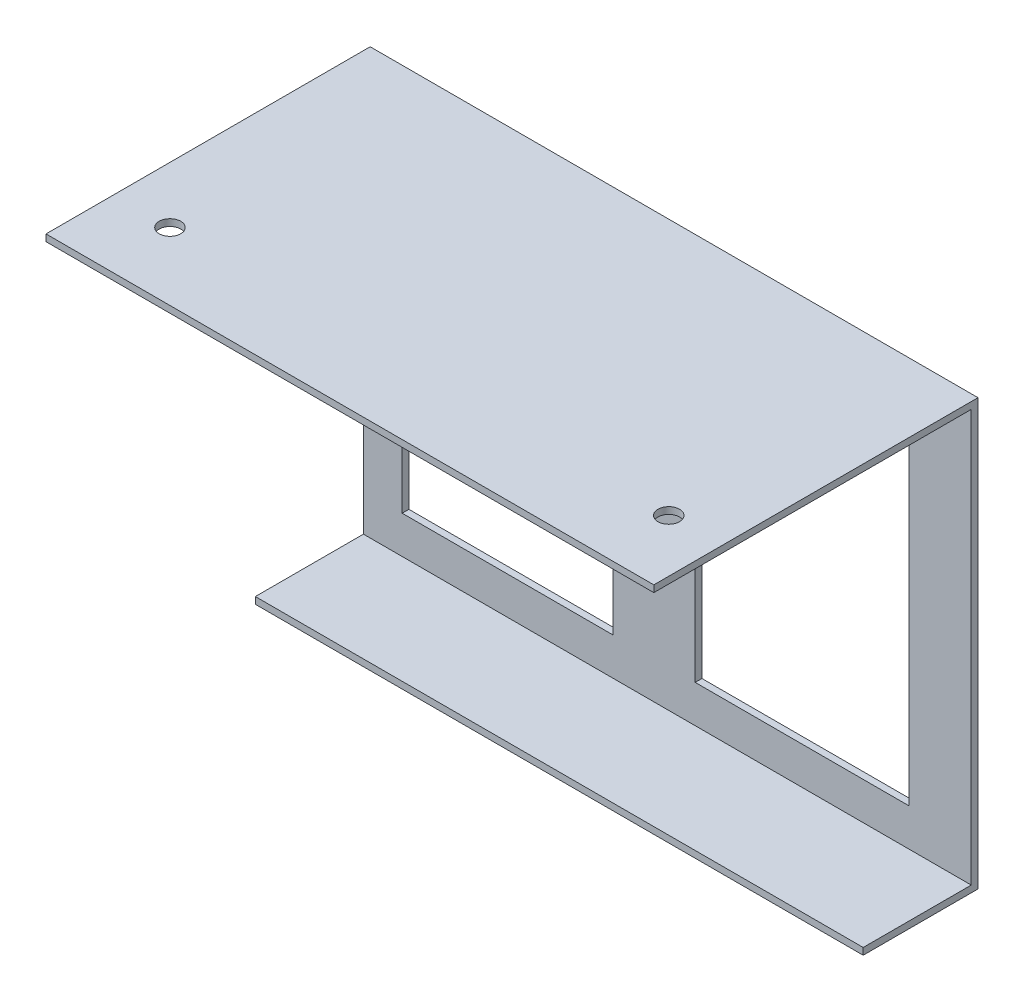
ISO-10303-21;
HEADER;
FILE_DESCRIPTION(('STEP AP214'),'2;1');
FILE_NAME('part.step','',(''),(''),'','','');
FILE_SCHEMA(('AUTOMOTIVE_DESIGN { 1 0 10303 214 1 1 1 1 }'));
ENDSEC;
DATA;
#1=APPLICATION_CONTEXT('core data for automotive mechanical design processes');
#2=APPLICATION_PROTOCOL_DEFINITION('international standard','automotive_design',2000,#1);
#3=PRODUCT_CONTEXT('',#1,'mechanical');
#4=PRODUCT('Part','Part','',(#3));
#5=PRODUCT_RELATED_PRODUCT_CATEGORY('part','',(#4));
#6=PRODUCT_DEFINITION_FORMATION('','',#4);
#7=PRODUCT_DEFINITION_CONTEXT('part definition',#1,'design');
#8=PRODUCT_DEFINITION('design','',#6,#7);
#9=PRODUCT_DEFINITION_SHAPE('','',#8);
#10=(LENGTH_UNIT() NAMED_UNIT(*) SI_UNIT(.MILLI.,.METRE.));
#11=(NAMED_UNIT(*) PLANE_ANGLE_UNIT() SI_UNIT($,.RADIAN.));
#12=(NAMED_UNIT(*) SI_UNIT($,.STERADIAN.) SOLID_ANGLE_UNIT());
#13=UNCERTAINTY_MEASURE_WITH_UNIT(LENGTH_MEASURE(1.E-05),#10,'distance_accuracy_value','');
#14=(GEOMETRIC_REPRESENTATION_CONTEXT(3) GLOBAL_UNCERTAINTY_ASSIGNED_CONTEXT((#13)) GLOBAL_UNIT_ASSIGNED_CONTEXT((#10,
#11,#12)) REPRESENTATION_CONTEXT('',''));
#15=CARTESIAN_POINT('',(0.,0.,0.));
#16=DIRECTION('',(0.,0.,1.));
#17=DIRECTION('',(1.,0.,0.));
#18=AXIS2_PLACEMENT_3D('',#15,#16,#17);
#19=CARTESIAN_POINT('',(0.,0.,1.));
#20=DIRECTION('',(0.,0.,-1.));
#21=DIRECTION('',(-1.,0.,0.));
#22=AXIS2_PLACEMENT_3D('',#19,#20,#21);
#23=PLANE('',#22);
#24=DIRECTION('',(1.,0.,0.));
#25=VECTOR('',#24,1.);
#26=CARTESIAN_POINT('',(49.1244560459894,6.55207074621018,1.));
#27=LINE('',#26,#25);
#28=CARTESIAN_POINT('',(49.1244560459894,6.55207074621018,1.));
#29=VERTEX_POINT('',#28);
#30=CARTESIAN_POINT('',(80.7788178948838,6.55207074621018,1.));
#31=VERTEX_POINT('',#30);
#32=EDGE_CURVE('E159',#29,#31,#27,.T.);
#33=ORIENTED_EDGE('',*,*,#32,.F.);
#34=DIRECTION('',(0.,-1.,0.));
#35=VECTOR('',#34,1.);
#36=CARTESIAN_POINT('',(49.1244560459894,55.4419643645238,1.));
#37=LINE('',#36,#35);
#38=CARTESIAN_POINT('',(49.1244560459894,55.4419643645238,1.));
#39=VERTEX_POINT('',#38);
#40=EDGE_CURVE('E50',#39,#29,#37,.T.);
#41=ORIENTED_EDGE('',*,*,#40,.F.);
#42=DIRECTION('',(-1.,0.,0.));
#43=VECTOR('',#42,1.);
#44=CARTESIAN_POINT('',(49.1244560459894,55.4419643645238,1.));
#45=LINE('',#44,#43);
#46=CARTESIAN_POINT('',(80.7788178948838,55.4419643645238,1.));
#47=VERTEX_POINT('',#46);
#48=EDGE_CURVE('E165',#47,#39,#45,.T.);
#49=ORIENTED_EDGE('',*,*,#48,.F.);
#50=DIRECTION('',(0.,1.,0.));
#51=VECTOR('',#50,1.);
#52=CARTESIAN_POINT('',(80.7788178948838,55.4419643645238,1.));
#53=LINE('',#52,#51);
#54=EDGE_CURVE('E150',#31,#47,#53,.T.);
#55=ORIENTED_EDGE('',*,*,#54,.F.);
#56=EDGE_LOOP('',(#33,#41,#49,#55));
#57=FACE_BOUND('',#56,.T.);
#58=DIRECTION('',(1.,0.,0.));
#59=VECTOR('',#58,1.);
#60=CARTESIAN_POINT('',(5.7338371556617,6.55207074621018,1.));
#61=LINE('',#60,#59);
#62=CARTESIAN_POINT('',(5.7338371556617,6.55207074621018,1.));
#63=VERTEX_POINT('',#62);
#64=CARTESIAN_POINT('',(36.9858130488498,6.55207074621018,1.));
#65=VERTEX_POINT('',#64);
#66=EDGE_CURVE('E176',#63,#65,#61,.T.);
#67=ORIENTED_EDGE('',*,*,#66,.F.);
#68=DIRECTION('',(0.,-1.,0.));
#69=VECTOR('',#68,1.);
#70=CARTESIAN_POINT('',(5.7338371556617,55.4419643645238,1.));
#71=LINE('',#70,#69);
#72=CARTESIAN_POINT('',(5.7338371556617,55.4419643645238,1.));
#73=VERTEX_POINT('',#72);
#74=EDGE_CURVE('E172',#73,#63,#71,.T.);
#75=ORIENTED_EDGE('',*,*,#74,.F.);
#76=DIRECTION('',(-1.,0.,0.));
#77=VECTOR('',#76,1.);
#78=CARTESIAN_POINT('',(5.7338371556617,55.4419643645238,1.));
#79=LINE('',#78,#77);
#80=CARTESIAN_POINT('',(36.9858130488498,55.4419643645238,1.));
#81=VERTEX_POINT('',#80);
#82=EDGE_CURVE('E182',#81,#73,#79,.T.);
#83=ORIENTED_EDGE('',*,*,#82,.F.);
#84=DIRECTION('',(0.,1.,0.));
#85=VECTOR('',#84,1.);
#86=CARTESIAN_POINT('',(36.9858130488498,55.4419643645238,1.));
#87=LINE('',#86,#85);
#88=EDGE_CURVE('E179',#65,#81,#87,.T.);
#89=ORIENTED_EDGE('',*,*,#88,.F.);
#90=EDGE_LOOP('',(#67,#75,#83,#89));
#91=FACE_BOUND('',#90,.T.);
#92=DIRECTION('',(1.,0.,0.));
#93=VECTOR('',#92,1.);
#94=CARTESIAN_POINT('',(0.,62.,1.));
#95=LINE('',#94,#93);
#96=CARTESIAN_POINT('',(0.,62.,1.));
#97=VERTEX_POINT('',#96);
#98=CARTESIAN_POINT('',(90.,62.,1.));
#99=VERTEX_POINT('',#98);
#100=EDGE_CURVE('E203',#97,#99,#95,.T.);
#101=ORIENTED_EDGE('',*,*,#100,.F.);
#102=DIRECTION('',(0.,-1.,0.));
#103=VECTOR('',#102,1.);
#104=CARTESIAN_POINT('',(0.,0.,1.));
#105=LINE('',#104,#103);
#106=CARTESIAN_POINT('',(0.,1.,1.));
#107=VERTEX_POINT('',#106);
#108=EDGE_CURVE('E242',#97,#107,#105,.T.);
#109=ORIENTED_EDGE('',*,*,#108,.T.);
#110=DIRECTION('',(-1.,0.,0.));
#111=VECTOR('',#110,1.);
#112=CARTESIAN_POINT('',(0.,1.,1.));
#113=LINE('',#112,#111);
#114=CARTESIAN_POINT('',(90.,1.,1.));
#115=VERTEX_POINT('',#114);
#116=EDGE_CURVE('E223',#115,#107,#113,.T.);
#117=ORIENTED_EDGE('',*,*,#116,.F.);
#118=DIRECTION('',(0.,1.,0.));
#119=VECTOR('',#118,1.);
#120=CARTESIAN_POINT('',(90.,0.,1.));
#121=LINE('',#120,#119);
#122=EDGE_CURVE('E233',#115,#99,#121,.T.);
#123=ORIENTED_EDGE('',*,*,#122,.T.);
#124=EDGE_LOOP('',(#101,#109,#117,#123));
#125=FACE_BOUND('',#124,.T.);
#126=ADVANCED_FACE('F35',(#57,#91,#125),#23,.F.);
#127=CARTESIAN_POINT('',(0.,0.,1.));
#128=DIRECTION('',(1.,0.,0.));
#129=DIRECTION('',(0.,0.,-1.));
#130=AXIS2_PLACEMENT_3D('',#127,#128,#129);
#131=PLANE('',#130);
#132=DIRECTION('',(0.,0.,-1.));
#133=VECTOR('',#132,1.);
#134=CARTESIAN_POINT('',(0.,0.,1.));
#135=LINE('',#134,#133);
#136=CARTESIAN_POINT('',(0.,0.,17.));
#137=VERTEX_POINT('',#136);
#138=CARTESIAN_POINT('',(0.,0.,0.));
#139=VERTEX_POINT('',#138);
#140=EDGE_CURVE('E248',#137,#139,#135,.T.);
#141=ORIENTED_EDGE('',*,*,#140,.F.);
#142=DIRECTION('',(0.,-1.,0.));
#143=VECTOR('',#142,1.);
#144=CARTESIAN_POINT('',(0.,0.,17.));
#145=LINE('',#144,#143);
#146=CARTESIAN_POINT('',(0.,1.,17.));
#147=VERTEX_POINT('',#146);
#148=EDGE_CURVE('E188',#147,#137,#145,.T.);
#149=ORIENTED_EDGE('',*,*,#148,.F.);
#150=DIRECTION('',(0.,0.,-1.));
#151=VECTOR('',#150,1.);
#152=CARTESIAN_POINT('',(0.,1.,48.));
#153=LINE('',#152,#151);
#154=EDGE_CURVE('E232',#147,#107,#153,.T.);
#155=ORIENTED_EDGE('',*,*,#154,.T.);
#156=ORIENTED_EDGE('',*,*,#108,.F.);
#157=DIRECTION('',(0.,0.,-1.));
#158=VECTOR('',#157,1.);
#159=CARTESIAN_POINT('',(0.,62.,48.));
#160=LINE('',#159,#158);
#161=CARTESIAN_POINT('',(0.,62.,48.));
#162=VERTEX_POINT('',#161);
#163=EDGE_CURVE('E220',#162,#97,#160,.T.);
#164=ORIENTED_EDGE('',*,*,#163,.F.);
#165=DIRECTION('',(0.,-1.,0.));
#166=VECTOR('',#165,1.);
#167=CARTESIAN_POINT('',(0.,63.,48.));
#168=LINE('',#167,#166);
#169=CARTESIAN_POINT('',(0.,63.,48.));
#170=VERTEX_POINT('',#169);
#171=EDGE_CURVE('E204',#170,#162,#168,.T.);
#172=ORIENTED_EDGE('',*,*,#171,.F.);
#173=DIRECTION('',(0.,0.,-1.));
#174=VECTOR('',#173,1.);
#175=CARTESIAN_POINT('',(0.,63.,1.));
#176=LINE('',#175,#174);
#177=CARTESIAN_POINT('',(0.,63.,0.));
#178=VERTEX_POINT('',#177);
#179=EDGE_CURVE('E310',#170,#178,#176,.T.);
#180=ORIENTED_EDGE('',*,*,#179,.T.);
#181=DIRECTION('',(0.,-1.,0.));
#182=VECTOR('',#181,1.);
#183=CARTESIAN_POINT('',(0.,0.,0.));
#184=LINE('',#183,#182);
#185=EDGE_CURVE('E244',#178,#139,#184,.T.);
#186=ORIENTED_EDGE('',*,*,#185,.T.);
#187=EDGE_LOOP('',(#141,#149,#155,#156,#164,#172,#180,#186));
#188=FACE_BOUND('',#187,.T.);
#189=ADVANCED_FACE('F37',(#188),#131,.F.);
#190=CARTESIAN_POINT('',(0.,0.,1.));
#191=DIRECTION('',(0.,1.,0.));
#192=DIRECTION('',(0.,0.,1.));
#193=AXIS2_PLACEMENT_3D('',#190,#191,#192);
#194=PLANE('',#193);
#195=DIRECTION('',(0.,0.,-1.));
#196=VECTOR('',#195,1.);
#197=CARTESIAN_POINT('',(90.,0.,1.));
#198=LINE('',#197,#196);
#199=CARTESIAN_POINT('',(90.,0.,17.));
#200=VERTEX_POINT('',#199);
#201=CARTESIAN_POINT('',(90.,0.,0.));
#202=VERTEX_POINT('',#201);
#203=EDGE_CURVE('E316',#200,#202,#198,.T.);
#204=ORIENTED_EDGE('',*,*,#203,.F.);
#205=DIRECTION('',(1.,0.,0.));
#206=VECTOR('',#205,1.);
#207=CARTESIAN_POINT('',(0.,0.,17.));
#208=LINE('',#207,#206);
#209=EDGE_CURVE('E196',#137,#200,#208,.T.);
#210=ORIENTED_EDGE('',*,*,#209,.F.);
#211=ORIENTED_EDGE('',*,*,#140,.T.);
#212=DIRECTION('',(1.,0.,0.));
#213=VECTOR('',#212,1.);
#214=CARTESIAN_POINT('',(0.,0.,0.));
#215=LINE('',#214,#213);
#216=EDGE_CURVE('E328',#139,#202,#215,.T.);
#217=ORIENTED_EDGE('',*,*,#216,.T.);
#218=EDGE_LOOP('',(#204,#210,#211,#217));
#219=FACE_BOUND('',#218,.T.);
#220=ADVANCED_FACE('F327',(#219),#194,.F.);
#221=CARTESIAN_POINT('',(90.,0.,1.));
#222=DIRECTION('',(-1.,0.,0.));
#223=DIRECTION('',(0.,0.,1.));
#224=AXIS2_PLACEMENT_3D('',#221,#222,#223);
#225=PLANE('',#224);
#226=DIRECTION('',(0.,0.,-1.));
#227=VECTOR('',#226,1.);
#228=CARTESIAN_POINT('',(90.,1.,48.));
#229=LINE('',#228,#227);
#230=CARTESIAN_POINT('',(90.,1.,17.));
#231=VERTEX_POINT('',#230);
#232=EDGE_CURVE('E241',#231,#115,#229,.T.);
#233=ORIENTED_EDGE('',*,*,#232,.F.);
#234=DIRECTION('',(0.,-1.,0.));
#235=VECTOR('',#234,1.);
#236=CARTESIAN_POINT('',(90.,0.,17.));
#237=LINE('',#236,#235);
#238=EDGE_CURVE('E200',#231,#200,#237,.T.);
#239=ORIENTED_EDGE('',*,*,#238,.T.);
#240=ORIENTED_EDGE('',*,*,#203,.T.);
#241=DIRECTION('',(0.,1.,0.));
#242=VECTOR('',#241,1.);
#243=CARTESIAN_POINT('',(90.,0.,0.));
#244=LINE('',#243,#242);
#245=CARTESIAN_POINT('',(90.,63.,0.));
#246=VERTEX_POINT('',#245);
#247=EDGE_CURVE('E332',#202,#246,#244,.T.);
#248=ORIENTED_EDGE('',*,*,#247,.T.);
#249=DIRECTION('',(0.,0.,-1.));
#250=VECTOR('',#249,1.);
#251=CARTESIAN_POINT('',(90.,63.,1.));
#252=LINE('',#251,#250);
#253=CARTESIAN_POINT('',(90.,63.,48.));
#254=VERTEX_POINT('',#253);
#255=EDGE_CURVE('E302',#254,#246,#252,.T.);
#256=ORIENTED_EDGE('',*,*,#255,.F.);
#257=DIRECTION('',(0.,1.,0.));
#258=VECTOR('',#257,1.);
#259=CARTESIAN_POINT('',(90.,63.,48.));
#260=LINE('',#259,#258);
#261=CARTESIAN_POINT('',(90.,62.,48.));
#262=VERTEX_POINT('',#261);
#263=EDGE_CURVE('E209',#262,#254,#260,.T.);
#264=ORIENTED_EDGE('',*,*,#263,.F.);
#265=DIRECTION('',(0.,0.,-1.));
#266=VECTOR('',#265,1.);
#267=CARTESIAN_POINT('',(90.,62.,48.));
#268=LINE('',#267,#266);
#269=EDGE_CURVE('E215',#262,#99,#268,.T.);
#270=ORIENTED_EDGE('',*,*,#269,.T.);
#271=ORIENTED_EDGE('',*,*,#122,.F.);
#272=EDGE_LOOP('',(#233,#239,#240,#248,#256,#264,#270,#271));
#273=FACE_BOUND('',#272,.T.);
#274=ADVANCED_FACE('F300',(#273),#225,.F.);
#275=CARTESIAN_POINT('',(0.,63.,1.));
#276=DIRECTION('',(0.,-1.,0.));
#277=DIRECTION('',(0.,0.,-1.));
#278=AXIS2_PLACEMENT_3D('',#275,#276,#277);
#279=PLANE('',#278);
#280=CARTESIAN_POINT('',(82.205212471865,63.,38.));
#281=DIRECTION('',(0.,-1.,0.));
#282=DIRECTION('',(0.,0.,-1.));
#283=AXIS2_PLACEMENT_3D('',#280,#281,#282);
#284=CIRCLE('',#283,1.60000000000001);
#285=CARTESIAN_POINT('',(82.205212471865,63.,36.4));
#286=VERTEX_POINT('',#285);
#287=EDGE_CURVE('E273',#286,#286,#284,.T.);
#288=ORIENTED_EDGE('',*,*,#287,.T.);
#289=EDGE_LOOP('',(#288));
#290=FACE_BOUND('',#289,.T.);
#291=CARTESIAN_POINT('',(8.3581508182187,63.,38.));
#292=DIRECTION('',(0.,-1.,0.));
#293=DIRECTION('',(0.,0.,-1.));
#294=AXIS2_PLACEMENT_3D('',#291,#292,#293);
#295=CIRCLE('',#294,1.6);
#296=CARTESIAN_POINT('',(8.3581508182187,63.,36.4));
#297=VERTEX_POINT('',#296);
#298=EDGE_CURVE('E266',#297,#297,#295,.T.);
#299=ORIENTED_EDGE('',*,*,#298,.T.);
#300=EDGE_LOOP('',(#299));
#301=FACE_BOUND('',#300,.T.);
#302=DIRECTION('',(-1.,0.,0.));
#303=VECTOR('',#302,1.);
#304=CARTESIAN_POINT('',(0.,63.,0.));
#305=LINE('',#304,#303);
#306=EDGE_CURVE('E311',#246,#178,#305,.T.);
#307=ORIENTED_EDGE('',*,*,#306,.T.);
#308=ORIENTED_EDGE('',*,*,#179,.F.);
#309=DIRECTION('',(-1.,0.,0.));
#310=VECTOR('',#309,1.);
#311=CARTESIAN_POINT('',(0.,63.,48.));
#312=LINE('',#311,#310);
#313=EDGE_CURVE('E212',#254,#170,#312,.T.);
#314=ORIENTED_EDGE('',*,*,#313,.F.);
#315=ORIENTED_EDGE('',*,*,#255,.T.);
#316=EDGE_LOOP('',(#307,#308,#314,#315));
#317=FACE_BOUND('',#316,.T.);
#318=ADVANCED_FACE('F307',(#290,#301,#317),#279,.F.);
#319=CARTESIAN_POINT('',(0.,0.,0.));
#320=DIRECTION('',(0.,0.,-1.));
#321=DIRECTION('',(-1.,0.,0.));
#322=AXIS2_PLACEMENT_3D('',#319,#320,#321);
#323=PLANE('',#322);
#324=DIRECTION('',(0.,1.,0.));
#325=VECTOR('',#324,1.);
#326=CARTESIAN_POINT('',(49.1244560459894,0.,0.));
#327=LINE('',#326,#325);
#328=CARTESIAN_POINT('',(49.1244560459894,6.55207074621018,0.));
#329=VERTEX_POINT('',#328);
#330=CARTESIAN_POINT('',(49.1244560459894,55.4419643645238,0.));
#331=VERTEX_POINT('',#330);
#332=EDGE_CURVE('E11',#329,#331,#327,.T.);
#333=ORIENTED_EDGE('',*,*,#332,.F.);
#334=DIRECTION('',(-1.,0.,0.));
#335=VECTOR('',#334,1.);
#336=CARTESIAN_POINT('',(0.,6.55207074621018,0.));
#337=LINE('',#336,#335);
#338=CARTESIAN_POINT('',(80.7788178948838,6.55207074621018,0.));
#339=VERTEX_POINT('',#338);
#340=EDGE_CURVE('E255',#339,#329,#337,.T.);
#341=ORIENTED_EDGE('',*,*,#340,.F.);
#342=DIRECTION('',(0.,-1.,0.));
#343=VECTOR('',#342,1.);
#344=CARTESIAN_POINT('',(80.7788178948838,0.,0.));
#345=LINE('',#344,#343);
#346=CARTESIAN_POINT('',(80.7788178948838,55.4419643645238,0.));
#347=VERTEX_POINT('',#346);
#348=EDGE_CURVE('E153',#347,#339,#345,.T.);
#349=ORIENTED_EDGE('',*,*,#348,.F.);
#350=DIRECTION('',(1.,0.,0.));
#351=VECTOR('',#350,1.);
#352=CARTESIAN_POINT('',(0.,55.4419643645238,0.));
#353=LINE('',#352,#351);
#354=EDGE_CURVE('E43',#331,#347,#353,.T.);
#355=ORIENTED_EDGE('',*,*,#354,.F.);
#356=EDGE_LOOP('',(#333,#341,#349,#355));
#357=FACE_BOUND('',#356,.T.);
#358=DIRECTION('',(0.,1.,0.));
#359=VECTOR('',#358,1.);
#360=CARTESIAN_POINT('',(5.7338371556617,0.,0.));
#361=LINE('',#360,#359);
#362=CARTESIAN_POINT('',(5.7338371556617,6.55207074621018,0.));
#363=VERTEX_POINT('',#362);
#364=CARTESIAN_POINT('',(5.7338371556617,55.4419643645238,0.));
#365=VERTEX_POINT('',#364);
#366=EDGE_CURVE('E253',#363,#365,#361,.T.);
#367=ORIENTED_EDGE('',*,*,#366,.F.);
#368=DIRECTION('',(-1.,0.,0.));
#369=VECTOR('',#368,1.);
#370=CARTESIAN_POINT('',(0.,6.55207074621018,0.));
#371=LINE('',#370,#369);
#372=CARTESIAN_POINT('',(36.9858130488498,6.55207074621018,0.));
#373=VERTEX_POINT('',#372);
#374=EDGE_CURVE('E245',#373,#363,#371,.T.);
#375=ORIENTED_EDGE('',*,*,#374,.F.);
#376=DIRECTION('',(0.,-1.,0.));
#377=VECTOR('',#376,1.);
#378=CARTESIAN_POINT('',(36.9858130488498,0.,0.));
#379=LINE('',#378,#377);
#380=CARTESIAN_POINT('',(36.9858130488498,55.4419643645238,0.));
#381=VERTEX_POINT('',#380);
#382=EDGE_CURVE('E247',#381,#373,#379,.T.);
#383=ORIENTED_EDGE('',*,*,#382,.F.);
#384=DIRECTION('',(1.,0.,0.));
#385=VECTOR('',#384,1.);
#386=CARTESIAN_POINT('',(0.,55.4419643645238,0.));
#387=LINE('',#386,#385);
#388=EDGE_CURVE('E251',#365,#381,#387,.T.);
#389=ORIENTED_EDGE('',*,*,#388,.F.);
#390=EDGE_LOOP('',(#367,#375,#383,#389));
#391=FACE_BOUND('',#390,.T.);
#392=ORIENTED_EDGE('',*,*,#185,.F.);
#393=ORIENTED_EDGE('',*,*,#306,.F.);
#394=ORIENTED_EDGE('',*,*,#247,.F.);
#395=ORIENTED_EDGE('',*,*,#216,.F.);
#396=EDGE_LOOP('',(#392,#393,#394,#395));
#397=FACE_BOUND('',#396,.T.);
#398=ADVANCED_FACE('F263',(#357,#391,#397),#323,.T.);
#399=CARTESIAN_POINT('',(0.,1.,48.));
#400=DIRECTION('',(0.,-1.,0.));
#401=DIRECTION('',(1.,0.,0.));
#402=AXIS2_PLACEMENT_3D('',#399,#400,#401);
#403=PLANE('',#402);
#404=ORIENTED_EDGE('',*,*,#154,.F.);
#405=DIRECTION('',(-1.,0.,0.));
#406=VECTOR('',#405,1.);
#407=CARTESIAN_POINT('',(0.,1.,17.));
#408=LINE('',#407,#406);
#409=EDGE_CURVE('E198',#231,#147,#408,.T.);
#410=ORIENTED_EDGE('',*,*,#409,.F.);
#411=ORIENTED_EDGE('',*,*,#232,.T.);
#412=ORIENTED_EDGE('',*,*,#116,.T.);
#413=EDGE_LOOP('',(#404,#410,#411,#412));
#414=FACE_BOUND('',#413,.T.);
#415=ADVANCED_FACE('F287',(#414),#403,.F.);
#416=CARTESIAN_POINT('',(0.,62.,48.));
#417=DIRECTION('',(0.,1.,0.));
#418=DIRECTION('',(0.,0.,1.));
#419=AXIS2_PLACEMENT_3D('',#416,#417,#418);
#420=PLANE('',#419);
#421=CARTESIAN_POINT('',(82.205212471865,62.,38.));
#422=DIRECTION('',(0.,-1.,0.));
#423=DIRECTION('',(0.,0.,-1.));
#424=AXIS2_PLACEMENT_3D('',#421,#422,#423);
#425=CIRCLE('',#424,1.60000000000001);
#426=CARTESIAN_POINT('',(82.205212471865,62.,36.4));
#427=VERTEX_POINT('',#426);
#428=EDGE_CURVE('E276',#427,#427,#425,.T.);
#429=ORIENTED_EDGE('',*,*,#428,.F.);
#430=EDGE_LOOP('',(#429));
#431=FACE_BOUND('',#430,.T.);
#432=CARTESIAN_POINT('',(8.3581508182187,62.,38.));
#433=DIRECTION('',(0.,-1.,0.));
#434=DIRECTION('',(0.,0.,-1.));
#435=AXIS2_PLACEMENT_3D('',#432,#433,#434);
#436=CIRCLE('',#435,1.6);
#437=CARTESIAN_POINT('',(8.3581508182187,62.,36.4));
#438=VERTEX_POINT('',#437);
#439=EDGE_CURVE('E268',#438,#438,#436,.T.);
#440=ORIENTED_EDGE('',*,*,#439,.F.);
#441=EDGE_LOOP('',(#440));
#442=FACE_BOUND('',#441,.T.);
#443=ORIENTED_EDGE('',*,*,#100,.T.);
#444=ORIENTED_EDGE('',*,*,#269,.F.);
#445=DIRECTION('',(1.,0.,0.));
#446=VECTOR('',#445,1.);
#447=CARTESIAN_POINT('',(0.,62.,48.));
#448=LINE('',#447,#446);
#449=EDGE_CURVE('E207',#162,#262,#448,.T.);
#450=ORIENTED_EDGE('',*,*,#449,.F.);
#451=ORIENTED_EDGE('',*,*,#163,.T.);
#452=EDGE_LOOP('',(#443,#444,#450,#451));
#453=FACE_BOUND('',#452,.T.);
#454=ADVANCED_FACE('F283',(#431,#442,#453),#420,.F.);
#455=CARTESIAN_POINT('',(0.,0.,48.));
#456=DIRECTION('',(0.,0.,1.));
#457=DIRECTION('',(1.,0.,0.));
#458=AXIS2_PLACEMENT_3D('',#455,#456,#457);
#459=PLANE('',#458);
#460=ORIENTED_EDGE('',*,*,#171,.T.);
#461=ORIENTED_EDGE('',*,*,#449,.T.);
#462=ORIENTED_EDGE('',*,*,#263,.T.);
#463=ORIENTED_EDGE('',*,*,#313,.T.);
#464=EDGE_LOOP('',(#460,#461,#462,#463));
#465=FACE_BOUND('',#464,.T.);
#466=ADVANCED_FACE('F286',(#465),#459,.T.);
#467=CARTESIAN_POINT('',(0.,0.,17.));
#468=DIRECTION('',(0.,0.,-1.));
#469=DIRECTION('',(-1.,0.,0.));
#470=AXIS2_PLACEMENT_3D('',#467,#468,#469);
#471=PLANE('',#470);
#472=ORIENTED_EDGE('',*,*,#409,.T.);
#473=ORIENTED_EDGE('',*,*,#148,.T.);
#474=ORIENTED_EDGE('',*,*,#209,.T.);
#475=ORIENTED_EDGE('',*,*,#238,.F.);
#476=EDGE_LOOP('',(#472,#473,#474,#475));
#477=FACE_BOUND('',#476,.T.);
#478=ADVANCED_FACE('F341',(#477),#471,.F.);
#479=CARTESIAN_POINT('',(5.7338371556617,55.4419643645238,-30.));
#480=DIRECTION('',(-1.,0.,0.));
#481=DIRECTION('',(0.,0.,1.));
#482=AXIS2_PLACEMENT_3D('',#479,#480,#481);
#483=PLANE('',#482);
#484=ORIENTED_EDGE('',*,*,#366,.T.);
#485=DIRECTION('',(0.,0.,1.));
#486=VECTOR('',#485,1.);
#487=CARTESIAN_POINT('',(5.7338371556617,55.4419643645238,-30.));
#488=LINE('',#487,#486);
#489=EDGE_CURVE('E186',#365,#73,#488,.T.);
#490=ORIENTED_EDGE('',*,*,#489,.T.);
#491=ORIENTED_EDGE('',*,*,#74,.T.);
#492=DIRECTION('',(0.,0.,1.));
#493=VECTOR('',#492,1.);
#494=CARTESIAN_POINT('',(5.7338371556617,6.55207074621018,-30.));
#495=LINE('',#494,#493);
#496=EDGE_CURVE('E185',#363,#63,#495,.T.);
#497=ORIENTED_EDGE('',*,*,#496,.F.);
#498=EDGE_LOOP('',(#484,#490,#491,#497));
#499=FACE_BOUND('',#498,.T.);
#500=ADVANCED_FACE('F343',(#499),#483,.F.);
#501=CARTESIAN_POINT('',(5.7338371556617,55.4419643645238,-30.));
#502=DIRECTION('',(0.,1.,0.));
#503=DIRECTION('',(0.,0.,1.));
#504=AXIS2_PLACEMENT_3D('',#501,#502,#503);
#505=PLANE('',#504);
#506=ORIENTED_EDGE('',*,*,#388,.T.);
#507=DIRECTION('',(0.,0.,1.));
#508=VECTOR('',#507,1.);
#509=CARTESIAN_POINT('',(36.9858130488498,55.4419643645238,-30.));
#510=LINE('',#509,#508);
#511=EDGE_CURVE('E189',#381,#81,#510,.T.);
#512=ORIENTED_EDGE('',*,*,#511,.T.);
#513=ORIENTED_EDGE('',*,*,#82,.T.);
#514=ORIENTED_EDGE('',*,*,#489,.F.);
#515=EDGE_LOOP('',(#506,#512,#513,#514));
#516=FACE_BOUND('',#515,.T.);
#517=ADVANCED_FACE('F349',(#516),#505,.F.);
#518=CARTESIAN_POINT('',(36.9858130488498,55.4419643645238,-30.));
#519=DIRECTION('',(1.,0.,0.));
#520=DIRECTION('',(0.,0.,-1.));
#521=AXIS2_PLACEMENT_3D('',#518,#519,#520);
#522=PLANE('',#521);
#523=ORIENTED_EDGE('',*,*,#382,.T.);
#524=DIRECTION('',(0.,0.,1.));
#525=VECTOR('',#524,1.);
#526=CARTESIAN_POINT('',(36.9858130488498,6.55207074621018,-30.));
#527=LINE('',#526,#525);
#528=EDGE_CURVE('E191',#373,#65,#527,.T.);
#529=ORIENTED_EDGE('',*,*,#528,.T.);
#530=ORIENTED_EDGE('',*,*,#88,.T.);
#531=ORIENTED_EDGE('',*,*,#511,.F.);
#532=EDGE_LOOP('',(#523,#529,#530,#531));
#533=FACE_BOUND('',#532,.T.);
#534=ADVANCED_FACE('F453',(#533),#522,.F.);
#535=CARTESIAN_POINT('',(5.7338371556617,6.55207074621018,-30.));
#536=DIRECTION('',(0.,-1.,0.));
#537=DIRECTION('',(0.,0.,-1.));
#538=AXIS2_PLACEMENT_3D('',#535,#536,#537);
#539=PLANE('',#538);
#540=ORIENTED_EDGE('',*,*,#374,.T.);
#541=ORIENTED_EDGE('',*,*,#496,.T.);
#542=ORIENTED_EDGE('',*,*,#66,.T.);
#543=ORIENTED_EDGE('',*,*,#528,.F.);
#544=EDGE_LOOP('',(#540,#541,#542,#543));
#545=FACE_BOUND('',#544,.T.);
#546=ADVANCED_FACE('F462',(#545),#539,.F.);
#547=CARTESIAN_POINT('',(49.1244560459894,55.4419643645238,-30.));
#548=DIRECTION('',(-1.,0.,0.));
#549=DIRECTION('',(0.,0.,1.));
#550=AXIS2_PLACEMENT_3D('',#547,#548,#549);
#551=PLANE('',#550);
#552=ORIENTED_EDGE('',*,*,#332,.T.);
#553=DIRECTION('',(0.,0.,1.));
#554=VECTOR('',#553,1.);
#555=CARTESIAN_POINT('',(49.1244560459894,55.4419643645238,-30.));
#556=LINE('',#555,#554);
#557=EDGE_CURVE('E170',#331,#39,#556,.T.);
#558=ORIENTED_EDGE('',*,*,#557,.T.);
#559=ORIENTED_EDGE('',*,*,#40,.T.);
#560=DIRECTION('',(0.,0.,1.));
#561=VECTOR('',#560,1.);
#562=CARTESIAN_POINT('',(49.1244560459894,6.55207074621018,-30.));
#563=LINE('',#562,#561);
#564=EDGE_CURVE('E156',#329,#29,#563,.T.);
#565=ORIENTED_EDGE('',*,*,#564,.F.);
#566=EDGE_LOOP('',(#552,#558,#559,#565));
#567=FACE_BOUND('',#566,.T.);
#568=ADVANCED_FACE('F265',(#567),#551,.F.);
#569=CARTESIAN_POINT('',(49.1244560459894,55.4419643645238,-30.));
#570=DIRECTION('',(0.,1.,0.));
#571=DIRECTION('',(0.,0.,1.));
#572=AXIS2_PLACEMENT_3D('',#569,#570,#571);
#573=PLANE('',#572);
#574=ORIENTED_EDGE('',*,*,#354,.T.);
#575=DIRECTION('',(0.,0.,1.));
#576=VECTOR('',#575,1.);
#577=CARTESIAN_POINT('',(80.7788178948838,55.4419643645238,-30.));
#578=LINE('',#577,#576);
#579=EDGE_CURVE('E155',#347,#47,#578,.T.);
#580=ORIENTED_EDGE('',*,*,#579,.T.);
#581=ORIENTED_EDGE('',*,*,#48,.T.);
#582=ORIENTED_EDGE('',*,*,#557,.F.);
#583=EDGE_LOOP('',(#574,#580,#581,#582));
#584=FACE_BOUND('',#583,.T.);
#585=ADVANCED_FACE('F260',(#584),#573,.F.);
#586=CARTESIAN_POINT('',(80.7788178948838,55.4419643645238,-30.));
#587=DIRECTION('',(1.,0.,0.));
#588=DIRECTION('',(0.,0.,-1.));
#589=AXIS2_PLACEMENT_3D('',#586,#587,#588);
#590=PLANE('',#589);
#591=ORIENTED_EDGE('',*,*,#348,.T.);
#592=DIRECTION('',(0.,0.,1.));
#593=VECTOR('',#592,1.);
#594=CARTESIAN_POINT('',(80.7788178948838,6.55207074621018,-30.));
#595=LINE('',#594,#593);
#596=EDGE_CURVE('E58',#339,#31,#595,.T.);
#597=ORIENTED_EDGE('',*,*,#596,.T.);
#598=ORIENTED_EDGE('',*,*,#54,.T.);
#599=ORIENTED_EDGE('',*,*,#579,.F.);
#600=EDGE_LOOP('',(#591,#597,#598,#599));
#601=FACE_BOUND('',#600,.T.);
#602=ADVANCED_FACE('F147',(#601),#590,.F.);
#603=CARTESIAN_POINT('',(49.1244560459894,6.55207074621018,-30.));
#604=DIRECTION('',(0.,-1.,0.));
#605=DIRECTION('',(0.,0.,-1.));
#606=AXIS2_PLACEMENT_3D('',#603,#604,#605);
#607=PLANE('',#606);
#608=ORIENTED_EDGE('',*,*,#340,.T.);
#609=ORIENTED_EDGE('',*,*,#564,.T.);
#610=ORIENTED_EDGE('',*,*,#32,.T.);
#611=ORIENTED_EDGE('',*,*,#596,.F.);
#612=EDGE_LOOP('',(#608,#609,#610,#611));
#613=FACE_BOUND('',#612,.T.);
#614=ADVANCED_FACE('F160',(#613),#607,.F.);
#615=CARTESIAN_POINT('',(8.3581508182187,93.,38.));
#616=DIRECTION('',(0.,-1.,0.));
#617=DIRECTION('',(0.,0.,-1.));
#618=AXIS2_PLACEMENT_3D('',#615,#616,#617);
#619=CYLINDRICAL_SURFACE('',#618,1.6);
#620=ORIENTED_EDGE('',*,*,#439,.T.);
#621=EDGE_LOOP('',(#620));
#622=FACE_BOUND('',#621,.T.);
#623=ORIENTED_EDGE('',*,*,#298,.F.);
#624=EDGE_LOOP('',(#623));
#625=FACE_BOUND('',#624,.T.);
#626=ADVANCED_FACE('F499',(#622,#625),#619,.F.);
#627=CARTESIAN_POINT('',(82.205212471865,93.,38.));
#628=DIRECTION('',(0.,-1.,0.));
#629=DIRECTION('',(0.,0.,-1.));
#630=AXIS2_PLACEMENT_3D('',#627,#628,#629);
#631=CYLINDRICAL_SURFACE('',#630,1.60000000000001);
#632=ORIENTED_EDGE('',*,*,#428,.T.);
#633=EDGE_LOOP('',(#632));
#634=FACE_BOUND('',#633,.T.);
#635=ORIENTED_EDGE('',*,*,#287,.F.);
#636=EDGE_LOOP('',(#635));
#637=FACE_BOUND('',#636,.T.);
#638=ADVANCED_FACE('F280',(#634,#637),#631,.F.);
#639=CLOSED_SHELL('',(#126,#189,#220,#274,#318,#398,#415,#454,#466,#478,#500,#517,#534,#546,
#568,#585,#602,#614,#626,#638));
#640=MANIFOLD_SOLID_BREP('B2',#639);
#641=ADVANCED_BREP_SHAPE_REPRESENTATION('',(#18,#640),#14);
#642=SHAPE_DEFINITION_REPRESENTATION(#9,#641);
ENDSEC;
END-ISO-10303-21;
